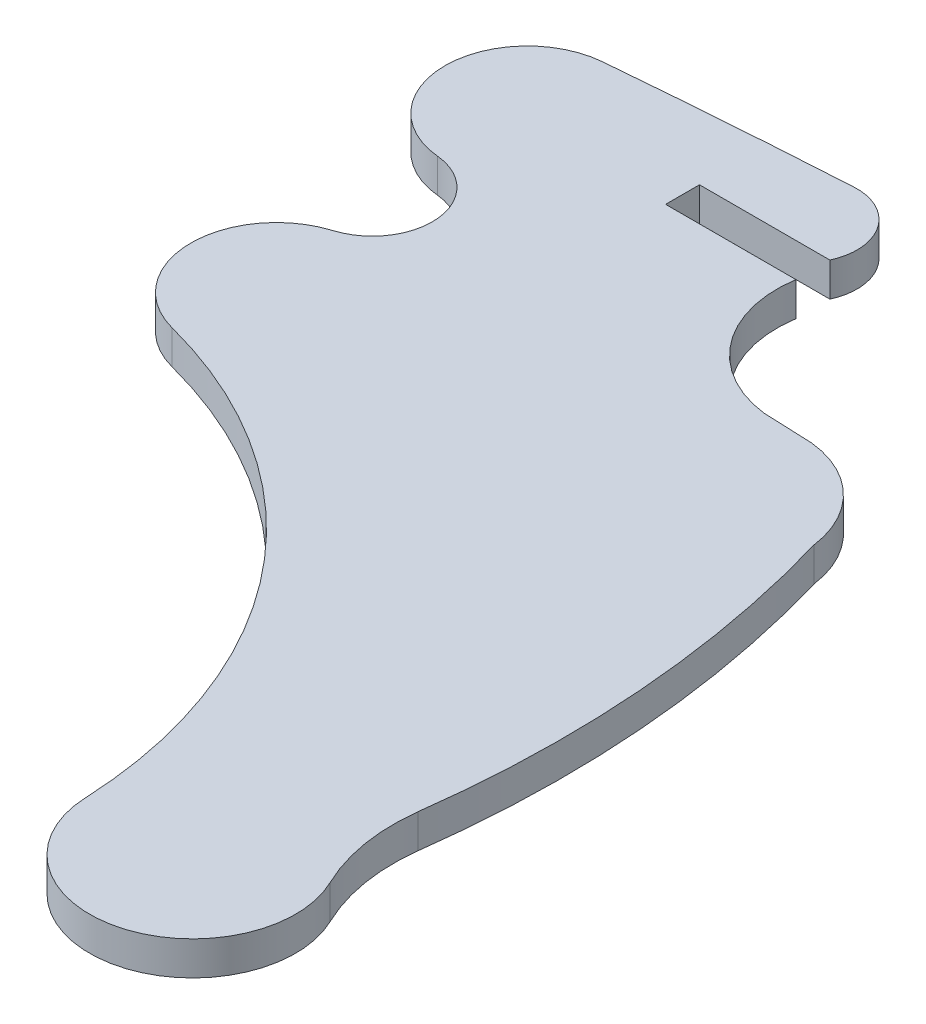
ISO-10303-21;
HEADER;
FILE_DESCRIPTION(('STEP AP214'),'2;1');
FILE_NAME('part.step','',(''),(''),'','','');
FILE_SCHEMA(('AUTOMOTIVE_DESIGN { 1 0 10303 214 1 1 1 1 }'));
ENDSEC;
DATA;
#1=APPLICATION_CONTEXT('core data for automotive mechanical design processes');
#2=APPLICATION_PROTOCOL_DEFINITION('international standard','automotive_design',2000,#1);
#3=PRODUCT_CONTEXT('',#1,'mechanical');
#4=PRODUCT('Part','Part','',(#3));
#5=PRODUCT_RELATED_PRODUCT_CATEGORY('part','',(#4));
#6=PRODUCT_DEFINITION_FORMATION('','',#4);
#7=PRODUCT_DEFINITION_CONTEXT('part definition',#1,'design');
#8=PRODUCT_DEFINITION('design','',#6,#7);
#9=PRODUCT_DEFINITION_SHAPE('','',#8);
#10=(LENGTH_UNIT() NAMED_UNIT(*) SI_UNIT(.MILLI.,.METRE.));
#11=(NAMED_UNIT(*) PLANE_ANGLE_UNIT() SI_UNIT($,.RADIAN.));
#12=(NAMED_UNIT(*) SI_UNIT($,.STERADIAN.) SOLID_ANGLE_UNIT());
#13=UNCERTAINTY_MEASURE_WITH_UNIT(LENGTH_MEASURE(1.E-05),#10,'distance_accuracy_value','');
#14=(GEOMETRIC_REPRESENTATION_CONTEXT(3) GLOBAL_UNCERTAINTY_ASSIGNED_CONTEXT((#13)) GLOBAL_UNIT_ASSIGNED_CONTEXT((#10,
#11,#12)) REPRESENTATION_CONTEXT('',''));
#15=CARTESIAN_POINT('',(0.,0.,0.));
#16=DIRECTION('',(0.,0.,1.));
#17=DIRECTION('',(1.,0.,0.));
#18=AXIS2_PLACEMENT_3D('',#15,#16,#17);
#19=CARTESIAN_POINT('',(-42007.813564086,3.,-18403.2242232196));
#20=DIRECTION('',(0.,-1.,0.));
#21=DIRECTION('',(0.,0.,-1.));
#22=AXIS2_PLACEMENT_3D('',#19,#20,#21);
#23=CYLINDRICAL_SURFACE('',#22,4.69313285869998);
#24=CARTESIAN_POINT('',(-42007.813564086,0.,-18403.2242232196));
#25=DIRECTION('',(0.,1.,0.));
#26=DIRECTION('',(0.,0.,1.));
#27=AXIS2_PLACEMENT_3D('',#24,#25,#26);
#28=CIRCLE('',#27,4.69313285869998);
#29=CARTESIAN_POINT('',(-42003.558594,0.,-18401.244141));
#30=VERTEX_POINT('',#29);
#31=CARTESIAN_POINT('',(-42008.085483,0.,-18407.9094719999));
#32=VERTEX_POINT('',#31);
#33=EDGE_CURVE('E173',#30,#32,#28,.T.);
#34=ORIENTED_EDGE('',*,*,#33,.T.);
#35=DIRECTION('',(0.,-1.,0.));
#36=VECTOR('',#35,1.);
#37=CARTESIAN_POINT('',(-42008.085483,3.,-18407.9094719999));
#38=LINE('',#37,#36);
#39=CARTESIAN_POINT('',(-42008.085483,3.,-18407.9094719999));
#40=VERTEX_POINT('',#39);
#41=EDGE_CURVE('E11',#40,#32,#38,.T.);
#42=ORIENTED_EDGE('',*,*,#41,.F.);
#43=CARTESIAN_POINT('',(-42007.813564086,3.,-18403.2242232196));
#44=DIRECTION('',(0.,1.,0.));
#45=DIRECTION('',(0.,0.,1.));
#46=AXIS2_PLACEMENT_3D('',#43,#44,#45);
#47=CIRCLE('',#46,4.69313285869998);
#48=CARTESIAN_POINT('',(-42003.558594,3.,-18401.244141));
#49=VERTEX_POINT('',#48);
#50=EDGE_CURVE('E201',#49,#40,#47,.T.);
#51=ORIENTED_EDGE('',*,*,#50,.F.);
#52=DIRECTION('',(0.,-1.,0.));
#53=VECTOR('',#52,1.);
#54=CARTESIAN_POINT('',(-42003.558594,3.,-18401.244141));
#55=LINE('',#54,#53);
#56=EDGE_CURVE('E169',#49,#30,#55,.T.);
#57=ORIENTED_EDGE('',*,*,#56,.T.);
#58=EDGE_LOOP('',(#34,#42,#51,#57));
#59=FACE_BOUND('',#58,.T.);
#60=ADVANCED_FACE('F35',(#59),#23,.T.);
#61=CARTESIAN_POINT('',(-41969.777339201,3.,-17743.9472663524));
#62=DIRECTION('',(0.,-1.,0.));
#63=DIRECTION('',(0.,0.,-1.));
#64=AXIS2_PLACEMENT_3D('',#61,#62,#63);
#65=CYLINDRICAL_SURFACE('',#64,665.066406014999);
#66=CARTESIAN_POINT('',(-41969.777339201,0.,-17743.9472663524));
#67=DIRECTION('',(0.,1.,0.));
#68=DIRECTION('',(0.,0.,1.));
#69=AXIS2_PLACEMENT_3D('',#66,#67,#68);
#70=CIRCLE('',#69,665.066406014999);
#71=CARTESIAN_POINT('',(-42028.8619710003,0.,-18406.383928));
#72=VERTEX_POINT('',#71);
#73=EDGE_CURVE('E176',#32,#72,#70,.T.);
#74=ORIENTED_EDGE('',*,*,#73,.T.);
#75=DIRECTION('',(0.,-1.,0.));
#76=VECTOR('',#75,1.);
#77=CARTESIAN_POINT('',(-42028.8619710003,3.,-18406.383928));
#78=LINE('',#77,#76);
#79=CARTESIAN_POINT('',(-42028.8619710003,3.,-18406.383928));
#80=VERTEX_POINT('',#79);
#81=EDGE_CURVE('E43',#80,#72,#78,.T.);
#82=ORIENTED_EDGE('',*,*,#81,.F.);
#83=CARTESIAN_POINT('',(-41969.777339201,3.,-17743.9472663524));
#84=DIRECTION('',(0.,1.,0.));
#85=DIRECTION('',(0.,0.,1.));
#86=AXIS2_PLACEMENT_3D('',#83,#84,#85);
#87=CIRCLE('',#86,665.066406014999);
#88=EDGE_CURVE('E115',#40,#80,#87,.T.);
#89=ORIENTED_EDGE('',*,*,#88,.F.);
#90=ORIENTED_EDGE('',*,*,#41,.T.);
#91=EDGE_LOOP('',(#74,#82,#89,#90));
#92=FACE_BOUND('',#91,.T.);
#93=ADVANCED_FACE('F294',(#92),#65,.T.);
#94=CARTESIAN_POINT('',(-42028.2148416599,3.,-18399.1082920063));
#95=DIRECTION('',(0.,-1.,0.));
#96=DIRECTION('',(0.,0.,-1.));
#97=AXIS2_PLACEMENT_3D('',#94,#95,#96);
#98=CYLINDRICAL_SURFACE('',#97,7.30435866420095);
#99=CARTESIAN_POINT('',(-42028.2148416599,0.,-18399.1082920063));
#100=DIRECTION('',(0.,1.,0.));
#101=DIRECTION('',(0.,0.,1.));
#102=AXIS2_PLACEMENT_3D('',#99,#100,#101);
#103=CIRCLE('',#102,7.30435866420095);
#104=CARTESIAN_POINT('',(-42028.9011059999,0.,-18391.836243));
#105=VERTEX_POINT('',#104);
#106=EDGE_CURVE('E178',#72,#105,#103,.T.);
#107=ORIENTED_EDGE('',*,*,#106,.T.);
#108=DIRECTION('',(0.,-1.,0.));
#109=VECTOR('',#108,1.);
#110=CARTESIAN_POINT('',(-42028.9011059999,3.,-18391.836243));
#111=LINE('',#110,#109);
#112=CARTESIAN_POINT('',(-42028.9011059999,3.,-18391.836243));
#113=VERTEX_POINT('',#112);
#114=EDGE_CURVE('E229',#113,#105,#111,.T.);
#115=ORIENTED_EDGE('',*,*,#114,.F.);
#116=CARTESIAN_POINT('',(-42028.2148416599,3.,-18399.1082920063));
#117=DIRECTION('',(0.,1.,0.));
#118=DIRECTION('',(0.,0.,1.));
#119=AXIS2_PLACEMENT_3D('',#116,#117,#118);
#120=CIRCLE('',#119,7.30435866420095);
#121=EDGE_CURVE('E237',#80,#113,#120,.T.);
#122=ORIENTED_EDGE('',*,*,#121,.F.);
#123=ORIENTED_EDGE('',*,*,#81,.T.);
#124=EDGE_LOOP('',(#107,#115,#122,#123));
#125=FACE_BOUND('',#124,.T.);
#126=ADVANCED_FACE('F235',(#125),#98,.T.);
#127=CARTESIAN_POINT('',(-42029.3984280307,3.,-18386.5585073323));
#128=DIRECTION('',(0.,-1.,0.));
#129=DIRECTION('',(0.,0.,-1.));
#130=AXIS2_PLACEMENT_3D('',#127,#128,#129);
#131=CYLINDRICAL_SURFACE('',#130,5.30111525817354);
#132=CARTESIAN_POINT('',(-42029.3984280307,0.,-18386.5585073323));
#133=DIRECTION('',(0.,-1.,0.));
#134=DIRECTION('',(0.,0.,1.));
#135=AXIS2_PLACEMENT_3D('',#132,#133,#134);
#136=CIRCLE('',#135,5.30111525817354);
#137=CARTESIAN_POINT('',(-42027.830825,0.,-18381.494473));
#138=VERTEX_POINT('',#137);
#139=EDGE_CURVE('E180',#105,#138,#136,.T.);
#140=ORIENTED_EDGE('',*,*,#139,.T.);
#141=DIRECTION('',(0.,-1.,0.));
#142=VECTOR('',#141,1.);
#143=CARTESIAN_POINT('',(-42027.830825,3.,-18381.494473));
#144=LINE('',#143,#142);
#145=CARTESIAN_POINT('',(-42027.830825,3.,-18381.494473));
#146=VERTEX_POINT('',#145);
#147=EDGE_CURVE('E226',#146,#138,#144,.T.);
#148=ORIENTED_EDGE('',*,*,#147,.F.);
#149=CARTESIAN_POINT('',(-42029.3984280307,3.,-18386.5585073323));
#150=DIRECTION('',(0.,-1.,0.));
#151=DIRECTION('',(0.,0.,1.));
#152=AXIS2_PLACEMENT_3D('',#149,#150,#151);
#153=CIRCLE('',#152,5.30111525817354);
#154=EDGE_CURVE('E255',#113,#146,#153,.T.);
#155=ORIENTED_EDGE('',*,*,#154,.F.);
#156=ORIENTED_EDGE('',*,*,#114,.T.);
#157=EDGE_LOOP('',(#140,#148,#155,#156));
#158=FACE_BOUND('',#157,.T.);
#159=ADVANCED_FACE('F246',(#158),#131,.F.);
#160=CARTESIAN_POINT('',(-42025.5898252994,3.,-18374.2511101852));
#161=DIRECTION('',(0.,-1.,0.));
#162=DIRECTION('',(0.,0.,-1.));
#163=AXIS2_PLACEMENT_3D('',#160,#161,#162);
#164=CYLINDRICAL_SURFACE('',#163,7.5821095035999);
#165=CARTESIAN_POINT('',(-42025.5898252994,0.,-18374.2511101852));
#166=DIRECTION('',(0.,1.,0.));
#167=DIRECTION('',(0.,0.,1.));
#168=AXIS2_PLACEMENT_3D('',#165,#166,#167);
#169=CIRCLE('',#168,7.5821095035999);
#170=CARTESIAN_POINT('',(-42027.507342,0.,-18366.915477));
#171=VERTEX_POINT('',#170);
#172=EDGE_CURVE('E182',#138,#171,#169,.T.);
#173=ORIENTED_EDGE('',*,*,#172,.T.);
#174=DIRECTION('',(0.,-1.,0.));
#175=VECTOR('',#174,1.);
#176=CARTESIAN_POINT('',(-42027.507342,3.,-18366.915477));
#177=LINE('',#176,#175);
#178=CARTESIAN_POINT('',(-42027.507342,3.,-18366.915477));
#179=VERTEX_POINT('',#178);
#180=EDGE_CURVE('E223',#179,#171,#177,.T.);
#181=ORIENTED_EDGE('',*,*,#180,.F.);
#182=CARTESIAN_POINT('',(-42025.5898252994,3.,-18374.2511101852));
#183=DIRECTION('',(0.,1.,0.));
#184=DIRECTION('',(0.,0.,1.));
#185=AXIS2_PLACEMENT_3D('',#182,#183,#184);
#186=CIRCLE('',#185,7.5821095035999);
#187=EDGE_CURVE('E252',#146,#179,#186,.T.);
#188=ORIENTED_EDGE('',*,*,#187,.F.);
#189=ORIENTED_EDGE('',*,*,#147,.T.);
#190=EDGE_LOOP('',(#173,#181,#188,#189));
#191=FACE_BOUND('',#190,.T.);
#192=ADVANCED_FACE('F250',(#191),#164,.T.);
#193=CARTESIAN_POINT('',(-42038.4345437132,3.,-18325.114457211));
#194=DIRECTION('',(0.,-1.,0.));
#195=DIRECTION('',(0.,0.,-1.));
#196=AXIS2_PLACEMENT_3D('',#193,#194,#195);
#197=CYLINDRICAL_SURFACE('',#196,43.2056592668227);
#198=CARTESIAN_POINT('',(-42038.4345437132,0.,-18325.114457211));
#199=DIRECTION('',(0.,-1.,0.));
#200=DIRECTION('',(0.,0.,1.));
#201=AXIS2_PLACEMENT_3D('',#198,#199,#200);
#202=CIRCLE('',#201,43.2056592668227);
#203=CARTESIAN_POINT('',(-41995.269582,0.,-18326.98931));
#204=VERTEX_POINT('',#203);
#205=EDGE_CURVE('E184',#171,#204,#202,.T.);
#206=ORIENTED_EDGE('',*,*,#205,.T.);
#207=DIRECTION('',(0.,-1.,0.));
#208=VECTOR('',#207,1.);
#209=CARTESIAN_POINT('',(-41995.269582,3.,-18326.98931));
#210=LINE('',#209,#208);
#211=CARTESIAN_POINT('',(-41995.269582,3.,-18326.98931));
#212=VERTEX_POINT('',#211);
#213=EDGE_CURVE('E220',#212,#204,#210,.T.);
#214=ORIENTED_EDGE('',*,*,#213,.F.);
#215=CARTESIAN_POINT('',(-42038.4345437132,3.,-18325.114457211));
#216=DIRECTION('',(0.,-1.,0.));
#217=DIRECTION('',(0.,0.,1.));
#218=AXIS2_PLACEMENT_3D('',#215,#216,#217);
#219=CIRCLE('',#218,43.2056592668227);
#220=EDGE_CURVE('E254',#179,#212,#219,.T.);
#221=ORIENTED_EDGE('',*,*,#220,.F.);
#222=ORIENTED_EDGE('',*,*,#180,.T.);
#223=EDGE_LOOP('',(#206,#214,#221,#222));
#224=FACE_BOUND('',#223,.T.);
#225=ADVANCED_FACE('F307',(#224),#197,.F.);
#226=CARTESIAN_POINT('',(-41986.1528680372,3.,-18327.3865868237));
#227=DIRECTION('',(0.,-1.,0.));
#228=DIRECTION('',(0.,0.,-1.));
#229=AXIS2_PLACEMENT_3D('',#226,#227,#228);
#230=CYLINDRICAL_SURFACE('',#229,9.12536587510349);
#231=CARTESIAN_POINT('',(-41986.1528680372,0.,-18327.3865868237));
#232=DIRECTION('',(0.,1.,0.));
#233=DIRECTION('',(0.,0.,1.));
#234=AXIS2_PLACEMENT_3D('',#231,#232,#233);
#235=CIRCLE('',#234,9.12536587510349);
#236=CARTESIAN_POINT('',(-41977.938337,0.,-18331.3607259999));
#237=VERTEX_POINT('',#236);
#238=EDGE_CURVE('E186',#204,#237,#235,.T.);
#239=ORIENTED_EDGE('',*,*,#238,.T.);
#240=DIRECTION('',(0.,-1.,0.));
#241=VECTOR('',#240,1.);
#242=CARTESIAN_POINT('',(-41977.938337,3.,-18331.3607259999));
#243=LINE('',#242,#241);
#244=CARTESIAN_POINT('',(-41977.938337,3.,-18331.3607259999));
#245=VERTEX_POINT('',#244);
#246=EDGE_CURVE('E217',#245,#237,#243,.T.);
#247=ORIENTED_EDGE('',*,*,#246,.F.);
#248=CARTESIAN_POINT('',(-41986.1528680372,3.,-18327.3865868237));
#249=DIRECTION('',(0.,1.,0.));
#250=DIRECTION('',(0.,0.,1.));
#251=AXIS2_PLACEMENT_3D('',#248,#249,#250);
#252=CIRCLE('',#251,9.12536587510349);
#253=EDGE_CURVE('E257',#212,#245,#252,.T.);
#254=ORIENTED_EDGE('',*,*,#253,.F.);
#255=ORIENTED_EDGE('',*,*,#213,.T.);
#256=EDGE_LOOP('',(#239,#247,#254,#255));
#257=FACE_BOUND('',#256,.T.);
#258=ADVANCED_FACE('F310',(#257),#230,.T.);
#259=CARTESIAN_POINT('',(-41962.9175374062,3.,-18338.6223828176));
#260=DIRECTION('',(0.,-1.,0.));
#261=DIRECTION('',(0.,0.,-1.));
#262=AXIS2_PLACEMENT_3D('',#259,#260,#261);
#263=CYLINDRICAL_SURFACE('',#262,16.6840067182082);
#264=CARTESIAN_POINT('',(-41962.9175374062,0.,-18338.6223828176));
#265=DIRECTION('',(0.,-1.,0.));
#266=DIRECTION('',(0.,0.,1.));
#267=AXIS2_PLACEMENT_3D('',#264,#265,#266);
#268=CIRCLE('',#267,16.6840067182082);
#269=CARTESIAN_POINT('',(-41979.474598,0.,-18340.676604));
#270=VERTEX_POINT('',#269);
#271=EDGE_CURVE('E188',#237,#270,#268,.T.);
#272=ORIENTED_EDGE('',*,*,#271,.T.);
#273=DIRECTION('',(0.,-1.,0.));
#274=VECTOR('',#273,1.);
#275=CARTESIAN_POINT('',(-41979.474598,3.,-18340.676604));
#276=LINE('',#275,#274);
#277=CARTESIAN_POINT('',(-41979.474598,3.,-18340.676604));
#278=VERTEX_POINT('',#277);
#279=EDGE_CURVE('E214',#278,#270,#276,.T.);
#280=ORIENTED_EDGE('',*,*,#279,.F.);
#281=CARTESIAN_POINT('',(-41962.9175374062,3.,-18338.6223828176));
#282=DIRECTION('',(0.,-1.,0.));
#283=DIRECTION('',(0.,0.,1.));
#284=AXIS2_PLACEMENT_3D('',#281,#282,#283);
#285=CIRCLE('',#284,16.6840067182082);
#286=EDGE_CURVE('E263',#245,#278,#285,.T.);
#287=ORIENTED_EDGE('',*,*,#286,.F.);
#288=ORIENTED_EDGE('',*,*,#246,.T.);
#289=EDGE_LOOP('',(#272,#280,#287,#288));
#290=FACE_BOUND('',#289,.T.);
#291=ADVANCED_FACE('F314',(#290),#263,.F.);
#292=CARTESIAN_POINT('',(-42071.0276520811,3.,-18352.742278464));
#293=DIRECTION('',(0.,-1.,0.));
#294=DIRECTION('',(0.,0.,-1.));
#295=AXIS2_PLACEMENT_3D('',#292,#293,#294);
#296=CYLINDRICAL_SURFACE('',#295,92.3446923858936);
#297=CARTESIAN_POINT('',(-42071.0276520811,0.,-18352.742278464));
#298=DIRECTION('',(0.,1.,0.));
#299=DIRECTION('',(0.,0.,1.));
#300=AXIS2_PLACEMENT_3D('',#297,#298,#299);
#301=CIRCLE('',#300,92.3446923858936);
#302=CARTESIAN_POINT('',(-41982.404563,0.,-18378.69397));
#303=VERTEX_POINT('',#302);
#304=EDGE_CURVE('E190',#270,#303,#301,.T.);
#305=ORIENTED_EDGE('',*,*,#304,.T.);
#306=DIRECTION('',(0.,-1.,0.));
#307=VECTOR('',#306,1.);
#308=CARTESIAN_POINT('',(-41982.404563,3.,-18378.69397));
#309=LINE('',#308,#307);
#310=CARTESIAN_POINT('',(-41982.404563,3.,-18378.69397));
#311=VERTEX_POINT('',#310);
#312=EDGE_CURVE('E211',#311,#303,#309,.T.);
#313=ORIENTED_EDGE('',*,*,#312,.F.);
#314=CARTESIAN_POINT('',(-42071.0276520811,3.,-18352.742278464));
#315=DIRECTION('',(0.,1.,0.));
#316=DIRECTION('',(0.,0.,1.));
#317=AXIS2_PLACEMENT_3D('',#314,#315,#316);
#318=CIRCLE('',#317,92.3446923858936);
#319=EDGE_CURVE('E265',#278,#311,#318,.T.);
#320=ORIENTED_EDGE('',*,*,#319,.F.);
#321=ORIENTED_EDGE('',*,*,#279,.T.);
#322=EDGE_LOOP('',(#305,#313,#320,#321));
#323=FACE_BOUND('',#322,.T.);
#324=ADVANCED_FACE('F318',(#323),#296,.T.);
#325=CARTESIAN_POINT('',(-41991.2544485396,3.,-18377.5240791153));
#326=DIRECTION('',(0.,-1.,0.));
#327=DIRECTION('',(0.,0.,-1.));
#328=AXIS2_PLACEMENT_3D('',#325,#326,#327);
#329=CYLINDRICAL_SURFACE('',#328,8.92687620310012);
#330=CARTESIAN_POINT('',(-41991.2544485396,0.,-18377.5240791153));
#331=DIRECTION('',(0.,1.,0.));
#332=DIRECTION('',(0.,0.,1.));
#333=AXIS2_PLACEMENT_3D('',#330,#331,#332);
#334=CIRCLE('',#333,8.92687620310012);
#335=CARTESIAN_POINT('',(-41990.348245,0.,-18386.40484));
#336=VERTEX_POINT('',#335);
#337=EDGE_CURVE('E192',#303,#336,#334,.T.);
#338=ORIENTED_EDGE('',*,*,#337,.T.);
#339=DIRECTION('',(0.,-1.,0.));
#340=VECTOR('',#339,1.);
#341=CARTESIAN_POINT('',(-41990.348245,3.,-18386.40484));
#342=LINE('',#341,#340);
#343=CARTESIAN_POINT('',(-41990.348245,3.,-18386.40484));
#344=VERTEX_POINT('',#343);
#345=EDGE_CURVE('E208',#344,#336,#342,.T.);
#346=ORIENTED_EDGE('',*,*,#345,.F.);
#347=CARTESIAN_POINT('',(-41991.2544485396,3.,-18377.5240791153));
#348=DIRECTION('',(0.,1.,0.));
#349=DIRECTION('',(0.,0.,1.));
#350=AXIS2_PLACEMENT_3D('',#347,#348,#349);
#351=CIRCLE('',#350,8.92687620310012);
#352=EDGE_CURVE('E267',#311,#344,#351,.T.);
#353=ORIENTED_EDGE('',*,*,#352,.F.);
#354=ORIENTED_EDGE('',*,*,#312,.T.);
#355=EDGE_LOOP('',(#338,#346,#353,#354));
#356=FACE_BOUND('',#355,.T.);
#357=ADVANCED_FACE('F322',(#356),#329,.T.);
#358=CARTESIAN_POINT('',(-41990.348245,3.,-18386.40484));
#359=DIRECTION('',(-0.04050917588155,0.,0.999179166450841));
#360=DIRECTION('',(0.999179166450841,0.,0.04050917588155));
#361=AXIS2_PLACEMENT_3D('',#358,#359,#360);
#362=PLANE('',#361);
#363=DIRECTION('',(-0.999179166450841,0.,-0.04050917588155));
#364=VECTOR('',#363,1.);
#365=CARTESIAN_POINT('',(-41990.348245,0.,-18386.40484));
#366=LINE('',#365,#364);
#367=CARTESIAN_POINT('',(-41994.71875,0.,-18386.582031));
#368=VERTEX_POINT('',#367);
#369=EDGE_CURVE('E194',#336,#368,#366,.T.);
#370=ORIENTED_EDGE('',*,*,#369,.T.);
#371=DIRECTION('',(0.,-1.,0.));
#372=VECTOR('',#371,1.);
#373=CARTESIAN_POINT('',(-41994.71875,3.,-18386.582031));
#374=LINE('',#373,#372);
#375=CARTESIAN_POINT('',(-41994.71875,3.,-18386.582031));
#376=VERTEX_POINT('',#375);
#377=EDGE_CURVE('E205',#376,#368,#374,.T.);
#378=ORIENTED_EDGE('',*,*,#377,.F.);
#379=DIRECTION('',(-0.999179166450841,0.,-0.04050917588155));
#380=VECTOR('',#379,1.);
#381=CARTESIAN_POINT('',(-41990.348245,3.,-18386.40484));
#382=LINE('',#381,#380);
#383=EDGE_CURVE('E269',#344,#376,#382,.T.);
#384=ORIENTED_EDGE('',*,*,#383,.F.);
#385=ORIENTED_EDGE('',*,*,#345,.T.);
#386=EDGE_LOOP('',(#370,#378,#384,#385));
#387=FACE_BOUND('',#386,.T.);
#388=ADVANCED_FACE('F275',(#387),#362,.F.);
#389=CARTESIAN_POINT('',(-41993.4964562255,3.,-18396.6899308513));
#390=DIRECTION('',(0.,-1.,0.));
#391=DIRECTION('',(0.,0.,-1.));
#392=AXIS2_PLACEMENT_3D('',#389,#390,#391);
#393=CYLINDRICAL_SURFACE('',#392,10.1815343379258);
#394=CARTESIAN_POINT('',(-41993.4964562255,0.,-18396.6899308513));
#395=DIRECTION('',(0.,-1.,0.));
#396=DIRECTION('',(0.,0.,1.));
#397=AXIS2_PLACEMENT_3D('',#394,#395,#396);
#398=CIRCLE('',#397,10.1815343379258);
#399=CARTESIAN_POINT('',(-42003.558719,0.,-18398.2438));
#400=VERTEX_POINT('',#399);
#401=EDGE_CURVE('E196',#368,#400,#398,.T.);
#402=ORIENTED_EDGE('',*,*,#401,.T.);
#403=DIRECTION('',(0.,-1.,0.));
#404=VECTOR('',#403,1.);
#405=CARTESIAN_POINT('',(-42003.558719,3.,-18398.2438));
#406=LINE('',#405,#404);
#407=CARTESIAN_POINT('',(-42003.558719,3.,-18398.2438));
#408=VERTEX_POINT('',#407);
#409=EDGE_CURVE('E164',#408,#400,#406,.T.);
#410=ORIENTED_EDGE('',*,*,#409,.F.);
#411=CARTESIAN_POINT('',(-41993.4964562255,3.,-18396.6899308513));
#412=DIRECTION('',(0.,-1.,0.));
#413=DIRECTION('',(0.,0.,1.));
#414=AXIS2_PLACEMENT_3D('',#411,#412,#413);
#415=CIRCLE('',#414,10.1815343379258);
#416=EDGE_CURVE('E155',#376,#408,#415,.T.);
#417=ORIENTED_EDGE('',*,*,#416,.F.);
#418=ORIENTED_EDGE('',*,*,#377,.T.);
#419=EDGE_LOOP('',(#402,#410,#417,#418));
#420=FACE_BOUND('',#419,.T.);
#421=ADVANCED_FACE('F279',(#420),#393,.F.);
#422=CARTESIAN_POINT('',(-42003.558719,3.,-18398.2438));
#423=DIRECTION('',(0.000139692989091539,0.,0.999999990242934));
#424=DIRECTION('',(0.999999990242935,0.,-0.000139692989091539));
#425=AXIS2_PLACEMENT_3D('',#422,#423,#424);
#426=PLANE('',#425);
#427=DIRECTION('',(-0.999999990242934,0.,0.000139692989091539));
#428=VECTOR('',#427,1.);
#429=CARTESIAN_POINT('',(-42003.558719,0.,-18398.2438));
#430=LINE('',#429,#428);
#431=CARTESIAN_POINT('',(-42015.105469,0.,-18398.242187));
#432=VERTEX_POINT('',#431);
#433=EDGE_CURVE('E163',#400,#432,#430,.T.);
#434=ORIENTED_EDGE('',*,*,#433,.T.);
#435=DIRECTION('',(0.,-1.,0.));
#436=VECTOR('',#435,1.);
#437=CARTESIAN_POINT('',(-42015.105469,3.,-18398.242187));
#438=LINE('',#437,#436);
#439=CARTESIAN_POINT('',(-42015.105469,3.,-18398.242187));
#440=VERTEX_POINT('',#439);
#441=EDGE_CURVE('E160',#440,#432,#438,.T.);
#442=ORIENTED_EDGE('',*,*,#441,.F.);
#443=DIRECTION('',(-0.999999990242934,0.,0.000139692989091539));
#444=VECTOR('',#443,1.);
#445=CARTESIAN_POINT('',(-42003.558719,3.,-18398.2438));
#446=LINE('',#445,#444);
#447=EDGE_CURVE('E149',#408,#440,#446,.T.);
#448=ORIENTED_EDGE('',*,*,#447,.F.);
#449=ORIENTED_EDGE('',*,*,#409,.T.);
#450=EDGE_LOOP('',(#434,#442,#448,#449));
#451=FACE_BOUND('',#450,.T.);
#452=ADVANCED_FACE('F161',(#451),#426,.F.);
#453=CARTESIAN_POINT('',(-42015.105469,3.,-18398.242187));
#454=DIRECTION('',(-1.,0.,0.));
#455=DIRECTION('',(0.,0.,1.));
#456=AXIS2_PLACEMENT_3D('',#453,#454,#455);
#457=PLANE('',#456);
#458=DIRECTION('',(0.,0.,-1.));
#459=VECTOR('',#458,1.);
#460=CARTESIAN_POINT('',(-42015.105469,0.,-18398.242187));
#461=LINE('',#460,#459);
#462=CARTESIAN_POINT('',(-42015.105469,0.,-18401.244141));
#463=VERTEX_POINT('',#462);
#464=EDGE_CURVE('E101',#432,#463,#461,.T.);
#465=ORIENTED_EDGE('',*,*,#464,.T.);
#466=DIRECTION('',(0.,-1.,0.));
#467=VECTOR('',#466,1.);
#468=CARTESIAN_POINT('',(-42015.105469,3.,-18401.244141));
#469=LINE('',#468,#467);
#470=CARTESIAN_POINT('',(-42015.105469,3.,-18401.244141));
#471=VERTEX_POINT('',#470);
#472=EDGE_CURVE('E165',#471,#463,#469,.T.);
#473=ORIENTED_EDGE('',*,*,#472,.F.);
#474=DIRECTION('',(0.,0.,-1.));
#475=VECTOR('',#474,1.);
#476=CARTESIAN_POINT('',(-42015.105469,3.,-18398.242187));
#477=LINE('',#476,#475);
#478=EDGE_CURVE('E153',#440,#471,#477,.T.);
#479=ORIENTED_EDGE('',*,*,#478,.F.);
#480=ORIENTED_EDGE('',*,*,#441,.T.);
#481=EDGE_LOOP('',(#465,#473,#479,#480));
#482=FACE_BOUND('',#481,.T.);
#483=ADVANCED_FACE('F167',(#482),#457,.F.);
#484=CARTESIAN_POINT('',(-42015.105469,3.,-18401.244141));
#485=DIRECTION('',(0.,0.,-1.));
#486=DIRECTION('',(-1.,0.,0.));
#487=AXIS2_PLACEMENT_3D('',#484,#485,#486);
#488=PLANE('',#487);
#489=DIRECTION('',(1.,0.,0.));
#490=VECTOR('',#489,1.);
#491=CARTESIAN_POINT('',(-42015.105469,0.,-18401.244141));
#492=LINE('',#491,#490);
#493=EDGE_CURVE('E107',#463,#30,#492,.T.);
#494=ORIENTED_EDGE('',*,*,#493,.T.);
#495=ORIENTED_EDGE('',*,*,#56,.F.);
#496=DIRECTION('',(1.,0.,0.));
#497=VECTOR('',#496,1.);
#498=CARTESIAN_POINT('',(-42015.105469,3.,-18401.244141));
#499=LINE('',#498,#497);
#500=EDGE_CURVE('E51',#471,#49,#499,.T.);
#501=ORIENTED_EDGE('',*,*,#500,.F.);
#502=ORIENTED_EDGE('',*,*,#472,.T.);
#503=EDGE_LOOP('',(#494,#495,#501,#502));
#504=FACE_BOUND('',#503,.T.);
#505=ADVANCED_FACE('F283',(#504),#488,.F.);
#506=CARTESIAN_POINT('',(-42007.813564086,3.,-18403.2242232196));
#507=DIRECTION('',(0.,1.,0.));
#508=DIRECTION('',(0.,0.,1.));
#509=AXIS2_PLACEMENT_3D('',#506,#507,#508);
#510=PLANE('',#509);
#511=ORIENTED_EDGE('',*,*,#50,.T.);
#512=ORIENTED_EDGE('',*,*,#88,.T.);
#513=ORIENTED_EDGE('',*,*,#121,.T.);
#514=ORIENTED_EDGE('',*,*,#154,.T.);
#515=ORIENTED_EDGE('',*,*,#187,.T.);
#516=ORIENTED_EDGE('',*,*,#220,.T.);
#517=ORIENTED_EDGE('',*,*,#253,.T.);
#518=ORIENTED_EDGE('',*,*,#286,.T.);
#519=ORIENTED_EDGE('',*,*,#319,.T.);
#520=ORIENTED_EDGE('',*,*,#352,.T.);
#521=ORIENTED_EDGE('',*,*,#383,.T.);
#522=ORIENTED_EDGE('',*,*,#416,.T.);
#523=ORIENTED_EDGE('',*,*,#447,.T.);
#524=ORIENTED_EDGE('',*,*,#478,.T.);
#525=ORIENTED_EDGE('',*,*,#500,.T.);
#526=EDGE_LOOP('',(#511,#512,#513,#514,#515,#516,#517,#518,#519,#520,#521,#522,#523,#524,#525));
#527=FACE_BOUND('',#526,.T.);
#528=ADVANCED_FACE('F151',(#527),#510,.T.);
#529=CARTESIAN_POINT('',(-42007.813564086,0.,-18403.2242232196));
#530=DIRECTION('',(0.,1.,0.));
#531=DIRECTION('',(0.,0.,1.));
#532=AXIS2_PLACEMENT_3D('',#529,#530,#531);
#533=PLANE('',#532);
#534=ORIENTED_EDGE('',*,*,#33,.F.);
#535=ORIENTED_EDGE('',*,*,#493,.F.);
#536=ORIENTED_EDGE('',*,*,#464,.F.);
#537=ORIENTED_EDGE('',*,*,#433,.F.);
#538=ORIENTED_EDGE('',*,*,#401,.F.);
#539=ORIENTED_EDGE('',*,*,#369,.F.);
#540=ORIENTED_EDGE('',*,*,#337,.F.);
#541=ORIENTED_EDGE('',*,*,#304,.F.);
#542=ORIENTED_EDGE('',*,*,#271,.F.);
#543=ORIENTED_EDGE('',*,*,#238,.F.);
#544=ORIENTED_EDGE('',*,*,#205,.F.);
#545=ORIENTED_EDGE('',*,*,#172,.F.);
#546=ORIENTED_EDGE('',*,*,#139,.F.);
#547=ORIENTED_EDGE('',*,*,#106,.F.);
#548=ORIENTED_EDGE('',*,*,#73,.F.);
#549=EDGE_LOOP('',(#534,#535,#536,#537,#538,#539,#540,#541,#542,#543,#544,#545,#546,#547,#548));
#550=FACE_BOUND('',#549,.T.);
#551=ADVANCED_FACE('F241',(#550),#533,.F.);
#552=CLOSED_SHELL('',(#60,#93,#126,#159,#192,#225,#258,#291,#324,#357,#388,#421,#452,#483,#505,
#528,#551));
#553=MANIFOLD_SOLID_BREP('B2',#552);
#554=ADVANCED_BREP_SHAPE_REPRESENTATION('',(#18,#553),#14);
#555=SHAPE_DEFINITION_REPRESENTATION(#9,#554);
ENDSEC;
END-ISO-10303-21;
